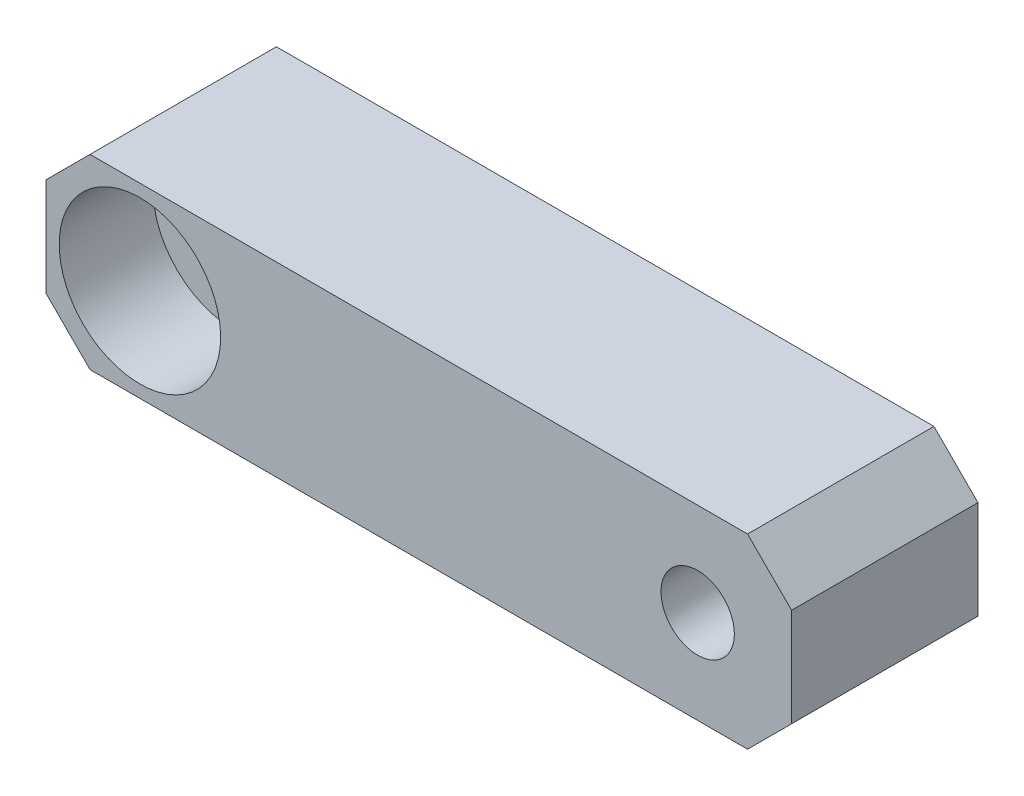
ISO-10303-21;
HEADER;
FILE_DESCRIPTION(('STEP AP214'),'2;1');
FILE_NAME('part.step','',(''),(''),'','','');
FILE_SCHEMA(('AUTOMOTIVE_DESIGN { 1 0 10303 214 1 1 1 1 }'));
ENDSEC;
DATA;
#1=APPLICATION_CONTEXT('core data for automotive mechanical design processes');
#2=APPLICATION_PROTOCOL_DEFINITION('international standard','automotive_design',2000,#1);
#3=PRODUCT_CONTEXT('',#1,'mechanical');
#4=PRODUCT('Part','Part','',(#3));
#5=PRODUCT_RELATED_PRODUCT_CATEGORY('part','',(#4));
#6=PRODUCT_DEFINITION_FORMATION('','',#4);
#7=PRODUCT_DEFINITION_CONTEXT('part definition',#1,'design');
#8=PRODUCT_DEFINITION('design','',#6,#7);
#9=PRODUCT_DEFINITION_SHAPE('','',#8);
#10=(LENGTH_UNIT() NAMED_UNIT(*) SI_UNIT(.MILLI.,.METRE.));
#11=(NAMED_UNIT(*) PLANE_ANGLE_UNIT() SI_UNIT($,.RADIAN.));
#12=(NAMED_UNIT(*) SI_UNIT($,.STERADIAN.) SOLID_ANGLE_UNIT());
#13=UNCERTAINTY_MEASURE_WITH_UNIT(LENGTH_MEASURE(1.E-05),#10,'distance_accuracy_value','');
#14=(GEOMETRIC_REPRESENTATION_CONTEXT(3) GLOBAL_UNCERTAINTY_ASSIGNED_CONTEXT((#13)) GLOBAL_UNIT_ASSIGNED_CONTEXT((#10,
#11,#12)) REPRESENTATION_CONTEXT('',''));
#15=CARTESIAN_POINT('',(0.,0.,0.));
#16=DIRECTION('',(0.,0.,1.));
#17=DIRECTION('',(1.,0.,0.));
#18=AXIS2_PLACEMENT_3D('',#15,#16,#17);
#19=CARTESIAN_POINT('',(22.4,6.35,6.35));
#20=DIRECTION('',(0.,-1.,0.));
#21=DIRECTION('',(0.,0.,-1.));
#22=AXIS2_PLACEMENT_3D('',#19,#20,#21);
#23=PLANE('',#22);
#24=DIRECTION('',(-1.,0.,0.));
#25=VECTOR('',#24,1.);
#26=CARTESIAN_POINT('',(22.4,6.35,-6.35));
#27=LINE('',#26,#25);
#28=CARTESIAN_POINT('',(22.4,6.35,-6.35));
#29=VERTEX_POINT('',#28);
#30=CARTESIAN_POINT('',(-22.4,6.35,-6.35));
#31=VERTEX_POINT('',#30);
#32=EDGE_CURVE('E131',#29,#31,#27,.T.);
#33=ORIENTED_EDGE('',*,*,#32,.T.);
#34=DIRECTION('',(0.,0.,-1.));
#35=VECTOR('',#34,1.);
#36=CARTESIAN_POINT('',(-22.4,6.35,6.35));
#37=LINE('',#36,#35);
#38=CARTESIAN_POINT('',(-22.4,6.35,6.35));
#39=VERTEX_POINT('',#38);
#40=EDGE_CURVE('E11',#39,#31,#37,.T.);
#41=ORIENTED_EDGE('',*,*,#40,.F.);
#42=DIRECTION('',(-1.,0.,0.));
#43=VECTOR('',#42,1.);
#44=CARTESIAN_POINT('',(22.4,6.35,6.35));
#45=LINE('',#44,#43);
#46=CARTESIAN_POINT('',(22.4,6.35,6.35));
#47=VERTEX_POINT('',#46);
#48=EDGE_CURVE('E146',#47,#39,#45,.T.);
#49=ORIENTED_EDGE('',*,*,#48,.F.);
#50=DIRECTION('',(0.,0.,-1.));
#51=VECTOR('',#50,1.);
#52=CARTESIAN_POINT('',(22.4,6.35,6.35));
#53=LINE('',#52,#51);
#54=EDGE_CURVE('E127',#47,#29,#53,.T.);
#55=ORIENTED_EDGE('',*,*,#54,.T.);
#56=EDGE_LOOP('',(#33,#41,#49,#55));
#57=FACE_BOUND('',#56,.T.);
#58=ADVANCED_FACE('F35',(#57),#23,.F.);
#59=CARTESIAN_POINT('',(-22.4,6.35,6.35));
#60=DIRECTION('',(0.707106781186548,-0.707106781186547,0.));
#61=DIRECTION('',(0.707106781186547,0.707106781186548,0.));
#62=AXIS2_PLACEMENT_3D('',#59,#60,#61);
#63=PLANE('',#62);
#64=DIRECTION('',(-0.707106781186547,-0.707106781186548,0.));
#65=VECTOR('',#64,1.);
#66=CARTESIAN_POINT('',(-22.4,6.35,-6.35));
#67=LINE('',#66,#65);
#68=CARTESIAN_POINT('',(-25.4,3.35,-6.35));
#69=VERTEX_POINT('',#68);
#70=EDGE_CURVE('E134',#31,#69,#67,.T.);
#71=ORIENTED_EDGE('',*,*,#70,.T.);
#72=DIRECTION('',(0.,0.,-1.));
#73=VECTOR('',#72,1.);
#74=CARTESIAN_POINT('',(-25.4,3.35,6.35));
#75=LINE('',#74,#73);
#76=CARTESIAN_POINT('',(-25.4,3.35,6.35));
#77=VERTEX_POINT('',#76);
#78=EDGE_CURVE('E43',#77,#69,#75,.T.);
#79=ORIENTED_EDGE('',*,*,#78,.F.);
#80=DIRECTION('',(-0.707106781186547,-0.707106781186548,0.));
#81=VECTOR('',#80,1.);
#82=CARTESIAN_POINT('',(-22.4,6.35,6.35));
#83=LINE('',#82,#81);
#84=EDGE_CURVE('E94',#39,#77,#83,.T.);
#85=ORIENTED_EDGE('',*,*,#84,.F.);
#86=ORIENTED_EDGE('',*,*,#40,.T.);
#87=EDGE_LOOP('',(#71,#79,#85,#86));
#88=FACE_BOUND('',#87,.T.);
#89=ADVANCED_FACE('F221',(#88),#63,.F.);
#90=CARTESIAN_POINT('',(-25.4,3.35,6.35));
#91=DIRECTION('',(1.,0.,0.));
#92=DIRECTION('',(0.,0.,-1.));
#93=AXIS2_PLACEMENT_3D('',#90,#91,#92);
#94=PLANE('',#93);
#95=DIRECTION('',(0.,-1.,0.));
#96=VECTOR('',#95,1.);
#97=CARTESIAN_POINT('',(-25.4,3.35,-6.35));
#98=LINE('',#97,#96);
#99=CARTESIAN_POINT('',(-25.4,-3.35,-6.35));
#100=VERTEX_POINT('',#99);
#101=EDGE_CURVE('E137',#69,#100,#98,.T.);
#102=ORIENTED_EDGE('',*,*,#101,.T.);
#103=DIRECTION('',(0.,0.,-1.));
#104=VECTOR('',#103,1.);
#105=CARTESIAN_POINT('',(-25.4,-3.35,6.35));
#106=LINE('',#105,#104);
#107=CARTESIAN_POINT('',(-25.4,-3.35,6.35));
#108=VERTEX_POINT('',#107);
#109=EDGE_CURVE('E153',#108,#100,#106,.T.);
#110=ORIENTED_EDGE('',*,*,#109,.F.);
#111=DIRECTION('',(0.,-1.,0.));
#112=VECTOR('',#111,1.);
#113=CARTESIAN_POINT('',(-25.4,3.35,6.35));
#114=LINE('',#113,#112);
#115=EDGE_CURVE('E161',#77,#108,#114,.T.);
#116=ORIENTED_EDGE('',*,*,#115,.F.);
#117=ORIENTED_EDGE('',*,*,#78,.T.);
#118=EDGE_LOOP('',(#102,#110,#116,#117));
#119=FACE_BOUND('',#118,.T.);
#120=ADVANCED_FACE('F159',(#119),#94,.F.);
#121=CARTESIAN_POINT('',(-22.4,-6.35,6.35));
#122=DIRECTION('',(0.707106781186548,0.707106781186547,0.));
#123=DIRECTION('',(-0.707106781186547,0.707106781186548,0.));
#124=AXIS2_PLACEMENT_3D('',#121,#122,#123);
#125=PLANE('',#124);
#126=DIRECTION('',(0.707106781186547,-0.707106781186548,0.));
#127=VECTOR('',#126,1.);
#128=CARTESIAN_POINT('',(-22.4,-6.35,-6.35));
#129=LINE('',#128,#127);
#130=CARTESIAN_POINT('',(-22.4,-6.35,-6.35));
#131=VERTEX_POINT('',#130);
#132=EDGE_CURVE('E139',#100,#131,#129,.T.);
#133=ORIENTED_EDGE('',*,*,#132,.T.);
#134=DIRECTION('',(0.,0.,-1.));
#135=VECTOR('',#134,1.);
#136=CARTESIAN_POINT('',(-22.4,-6.35,6.35));
#137=LINE('',#136,#135);
#138=CARTESIAN_POINT('',(-22.4,-6.35,6.35));
#139=VERTEX_POINT('',#138);
#140=EDGE_CURVE('E150',#139,#131,#137,.T.);
#141=ORIENTED_EDGE('',*,*,#140,.F.);
#142=DIRECTION('',(0.707106781186547,-0.707106781186548,0.));
#143=VECTOR('',#142,1.);
#144=CARTESIAN_POINT('',(-22.4,-6.35,6.35));
#145=LINE('',#144,#143);
#146=EDGE_CURVE('E173',#108,#139,#145,.T.);
#147=ORIENTED_EDGE('',*,*,#146,.F.);
#148=ORIENTED_EDGE('',*,*,#109,.T.);
#149=EDGE_LOOP('',(#133,#141,#147,#148));
#150=FACE_BOUND('',#149,.T.);
#151=ADVANCED_FACE('F169',(#150),#125,.F.);
#152=CARTESIAN_POINT('',(22.4,-6.35,6.35));
#153=DIRECTION('',(0.,1.,0.));
#154=DIRECTION('',(0.,0.,1.));
#155=AXIS2_PLACEMENT_3D('',#152,#153,#154);
#156=PLANE('',#155);
#157=DIRECTION('',(1.,0.,0.));
#158=VECTOR('',#157,1.);
#159=CARTESIAN_POINT('',(22.4,-6.35,-6.35));
#160=LINE('',#159,#158);
#161=CARTESIAN_POINT('',(22.4,-6.35,-6.35));
#162=VERTEX_POINT('',#161);
#163=EDGE_CURVE('E141',#131,#162,#160,.T.);
#164=ORIENTED_EDGE('',*,*,#163,.T.);
#165=DIRECTION('',(0.,0.,-1.));
#166=VECTOR('',#165,1.);
#167=CARTESIAN_POINT('',(22.4,-6.35,6.35));
#168=LINE('',#167,#166);
#169=CARTESIAN_POINT('',(22.4,-6.35,6.35));
#170=VERTEX_POINT('',#169);
#171=EDGE_CURVE('E122',#170,#162,#168,.T.);
#172=ORIENTED_EDGE('',*,*,#171,.F.);
#173=DIRECTION('',(1.,0.,0.));
#174=VECTOR('',#173,1.);
#175=CARTESIAN_POINT('',(22.4,-6.35,6.35));
#176=LINE('',#175,#174);
#177=EDGE_CURVE('E113',#139,#170,#176,.T.);
#178=ORIENTED_EDGE('',*,*,#177,.F.);
#179=ORIENTED_EDGE('',*,*,#140,.T.);
#180=EDGE_LOOP('',(#164,#172,#178,#179));
#181=FACE_BOUND('',#180,.T.);
#182=ADVANCED_FACE('F172',(#181),#156,.F.);
#183=CARTESIAN_POINT('',(25.4,-3.35,6.35));
#184=DIRECTION('',(-0.707106781186548,0.707106781186547,0.));
#185=DIRECTION('',(-0.707106781186547,-0.707106781186548,0.));
#186=AXIS2_PLACEMENT_3D('',#183,#184,#185);
#187=PLANE('',#186);
#188=DIRECTION('',(0.707106781186547,0.707106781186548,0.));
#189=VECTOR('',#188,1.);
#190=CARTESIAN_POINT('',(25.4,-3.35,-6.35));
#191=LINE('',#190,#189);
#192=CARTESIAN_POINT('',(25.4,-3.35,-6.35));
#193=VERTEX_POINT('',#192);
#194=EDGE_CURVE('E121',#162,#193,#191,.T.);
#195=ORIENTED_EDGE('',*,*,#194,.T.);
#196=DIRECTION('',(0.,0.,-1.));
#197=VECTOR('',#196,1.);
#198=CARTESIAN_POINT('',(25.4,-3.35,6.35));
#199=LINE('',#198,#197);
#200=CARTESIAN_POINT('',(25.4,-3.35,6.35));
#201=VERTEX_POINT('',#200);
#202=EDGE_CURVE('E118',#201,#193,#199,.T.);
#203=ORIENTED_EDGE('',*,*,#202,.F.);
#204=DIRECTION('',(0.707106781186547,0.707106781186548,0.));
#205=VECTOR('',#204,1.);
#206=CARTESIAN_POINT('',(25.4,-3.35,6.35));
#207=LINE('',#206,#205);
#208=EDGE_CURVE('E107',#170,#201,#207,.T.);
#209=ORIENTED_EDGE('',*,*,#208,.F.);
#210=ORIENTED_EDGE('',*,*,#171,.T.);
#211=EDGE_LOOP('',(#195,#203,#209,#210));
#212=FACE_BOUND('',#211,.T.);
#213=ADVANCED_FACE('F119',(#212),#187,.F.);
#214=CARTESIAN_POINT('',(25.4,3.35,6.35));
#215=DIRECTION('',(-1.,0.,0.));
#216=DIRECTION('',(0.,0.,1.));
#217=AXIS2_PLACEMENT_3D('',#214,#215,#216);
#218=PLANE('',#217);
#219=DIRECTION('',(0.,1.,0.));
#220=VECTOR('',#219,1.);
#221=CARTESIAN_POINT('',(25.4,3.35,-6.35));
#222=LINE('',#221,#220);
#223=CARTESIAN_POINT('',(25.4,3.35,-6.35));
#224=VERTEX_POINT('',#223);
#225=EDGE_CURVE('E80',#193,#224,#222,.T.);
#226=ORIENTED_EDGE('',*,*,#225,.T.);
#227=DIRECTION('',(0.,0.,-1.));
#228=VECTOR('',#227,1.);
#229=CARTESIAN_POINT('',(25.4,3.35,6.35));
#230=LINE('',#229,#228);
#231=CARTESIAN_POINT('',(25.4,3.35,6.35));
#232=VERTEX_POINT('',#231);
#233=EDGE_CURVE('E123',#232,#224,#230,.T.);
#234=ORIENTED_EDGE('',*,*,#233,.F.);
#235=DIRECTION('',(0.,1.,0.));
#236=VECTOR('',#235,1.);
#237=CARTESIAN_POINT('',(25.4,3.35,6.35));
#238=LINE('',#237,#236);
#239=EDGE_CURVE('E111',#201,#232,#238,.T.);
#240=ORIENTED_EDGE('',*,*,#239,.F.);
#241=ORIENTED_EDGE('',*,*,#202,.T.);
#242=EDGE_LOOP('',(#226,#234,#240,#241));
#243=FACE_BOUND('',#242,.T.);
#244=ADVANCED_FACE('F125',(#243),#218,.F.);
#245=CARTESIAN_POINT('',(25.4,3.35,6.35));
#246=DIRECTION('',(-0.707106781186548,-0.707106781186547,0.));
#247=DIRECTION('',(0.707106781186547,-0.707106781186548,0.));
#248=AXIS2_PLACEMENT_3D('',#245,#246,#247);
#249=PLANE('',#248);
#250=DIRECTION('',(-0.707106781186547,0.707106781186548,0.));
#251=VECTOR('',#250,1.);
#252=CARTESIAN_POINT('',(25.4,3.35,-6.35));
#253=LINE('',#252,#251);
#254=EDGE_CURVE('E86',#224,#29,#253,.T.);
#255=ORIENTED_EDGE('',*,*,#254,.T.);
#256=ORIENTED_EDGE('',*,*,#54,.F.);
#257=DIRECTION('',(-0.707106781186547,0.707106781186548,0.));
#258=VECTOR('',#257,1.);
#259=CARTESIAN_POINT('',(25.4,3.35,6.35));
#260=LINE('',#259,#258);
#261=EDGE_CURVE('E51',#232,#47,#260,.T.);
#262=ORIENTED_EDGE('',*,*,#261,.F.);
#263=ORIENTED_EDGE('',*,*,#233,.T.);
#264=EDGE_LOOP('',(#255,#256,#262,#263));
#265=FACE_BOUND('',#264,.T.);
#266=ADVANCED_FACE('F201',(#265),#249,.F.);
#267=CARTESIAN_POINT('',(0.,0.,6.35));
#268=DIRECTION('',(0.,0.,1.));
#269=DIRECTION('',(1.,0.,0.));
#270=AXIS2_PLACEMENT_3D('',#267,#268,#269);
#271=PLANE('',#270);
#272=CARTESIAN_POINT('',(-19.,0.,6.35));
#273=DIRECTION('',(0.,0.,1.));
#274=DIRECTION('',(1.,0.,0.));
#275=AXIS2_PLACEMENT_3D('',#272,#273,#274);
#276=CIRCLE('',#275,5.49999999999999);
#277=CARTESIAN_POINT('',(-13.5,0.,6.35));
#278=VERTEX_POINT('',#277);
#279=EDGE_CURVE('E193',#278,#278,#276,.T.);
#280=ORIENTED_EDGE('',*,*,#279,.F.);
#281=EDGE_LOOP('',(#280));
#282=FACE_BOUND('',#281,.T.);
#283=CARTESIAN_POINT('',(19.,0.,6.35));
#284=DIRECTION('',(0.,0.,1.));
#285=DIRECTION('',(1.,0.,0.));
#286=AXIS2_PLACEMENT_3D('',#283,#284,#285);
#287=CIRCLE('',#286,2.49999999999999);
#288=CARTESIAN_POINT('',(21.5,0.,6.35));
#289=VERTEX_POINT('',#288);
#290=EDGE_CURVE('E181',#289,#289,#287,.T.);
#291=ORIENTED_EDGE('',*,*,#290,.F.);
#292=EDGE_LOOP('',(#291));
#293=FACE_BOUND('',#292,.T.);
#294=ORIENTED_EDGE('',*,*,#48,.T.);
#295=ORIENTED_EDGE('',*,*,#84,.T.);
#296=ORIENTED_EDGE('',*,*,#115,.T.);
#297=ORIENTED_EDGE('',*,*,#146,.T.);
#298=ORIENTED_EDGE('',*,*,#177,.T.);
#299=ORIENTED_EDGE('',*,*,#208,.T.);
#300=ORIENTED_EDGE('',*,*,#239,.T.);
#301=ORIENTED_EDGE('',*,*,#261,.T.);
#302=EDGE_LOOP('',(#294,#295,#296,#297,#298,#299,#300,#301));
#303=FACE_BOUND('',#302,.T.);
#304=ADVANCED_FACE('F109',(#282,#293,#303),#271,.T.);
#305=CARTESIAN_POINT('',(0.,0.,-6.35));
#306=DIRECTION('',(0.,0.,1.));
#307=DIRECTION('',(1.,0.,0.));
#308=AXIS2_PLACEMENT_3D('',#305,#306,#307);
#309=PLANE('',#308);
#310=CARTESIAN_POINT('',(-19.,0.,-6.35));
#311=DIRECTION('',(0.,0.,1.));
#312=DIRECTION('',(1.,0.,0.));
#313=AXIS2_PLACEMENT_3D('',#310,#311,#312);
#314=CIRCLE('',#313,3.3);
#315=CARTESIAN_POINT('',(-15.7,0.,-6.35));
#316=VERTEX_POINT('',#315);
#317=EDGE_CURVE('E184',#316,#316,#314,.T.);
#318=ORIENTED_EDGE('',*,*,#317,.T.);
#319=EDGE_LOOP('',(#318));
#320=FACE_BOUND('',#319,.T.);
#321=CARTESIAN_POINT('',(19.,0.,-6.35));
#322=DIRECTION('',(0.,0.,1.));
#323=DIRECTION('',(1.,0.,0.));
#324=AXIS2_PLACEMENT_3D('',#321,#322,#323);
#325=CIRCLE('',#324,2.5);
#326=CARTESIAN_POINT('',(21.5,0.,-6.35));
#327=VERTEX_POINT('',#326);
#328=EDGE_CURVE('E135',#327,#327,#325,.T.);
#329=ORIENTED_EDGE('',*,*,#328,.T.);
#330=EDGE_LOOP('',(#329));
#331=FACE_BOUND('',#330,.T.);
#332=ORIENTED_EDGE('',*,*,#32,.F.);
#333=ORIENTED_EDGE('',*,*,#254,.F.);
#334=ORIENTED_EDGE('',*,*,#225,.F.);
#335=ORIENTED_EDGE('',*,*,#194,.F.);
#336=ORIENTED_EDGE('',*,*,#163,.F.);
#337=ORIENTED_EDGE('',*,*,#132,.F.);
#338=ORIENTED_EDGE('',*,*,#101,.F.);
#339=ORIENTED_EDGE('',*,*,#70,.F.);
#340=EDGE_LOOP('',(#332,#333,#334,#335,#336,#337,#338,#339));
#341=FACE_BOUND('',#340,.T.);
#342=ADVANCED_FACE('F165',(#320,#331,#341),#309,.F.);
#343=CARTESIAN_POINT('',(19.,0.,6.35));
#344=DIRECTION('',(0.,0.,1.));
#345=DIRECTION('',(1.,0.,0.));
#346=AXIS2_PLACEMENT_3D('',#343,#344,#345);
#347=CYLINDRICAL_SURFACE('',#346,2.49999999999999);
#348=ORIENTED_EDGE('',*,*,#328,.F.);
#349=EDGE_LOOP('',(#348));
#350=FACE_BOUND('',#349,.T.);
#351=ORIENTED_EDGE('',*,*,#290,.T.);
#352=EDGE_LOOP('',(#351));
#353=FACE_BOUND('',#352,.T.);
#354=ADVANCED_FACE('F205',(#350,#353),#347,.F.);
#355=CARTESIAN_POINT('',(-19.,0.,6.35));
#356=DIRECTION('',(0.,0.,1.));
#357=DIRECTION('',(1.,0.,0.));
#358=AXIS2_PLACEMENT_3D('',#355,#356,#357);
#359=CYLINDRICAL_SURFACE('',#358,3.3);
#360=ORIENTED_EDGE('',*,*,#317,.F.);
#361=EDGE_LOOP('',(#360));
#362=FACE_BOUND('',#361,.T.);
#363=CARTESIAN_POINT('',(-19.,0.,-0.0499999999999997));
#364=DIRECTION('',(0.,0.,1.));
#365=DIRECTION('',(1.,0.,0.));
#366=AXIS2_PLACEMENT_3D('',#363,#364,#365);
#367=CIRCLE('',#366,3.3);
#368=CARTESIAN_POINT('',(-15.7,0.,-0.0499999999999997));
#369=VERTEX_POINT('',#368);
#370=EDGE_CURVE('E187',#369,#369,#367,.T.);
#371=ORIENTED_EDGE('',*,*,#370,.T.);
#372=EDGE_LOOP('',(#371));
#373=FACE_BOUND('',#372,.T.);
#374=ADVANCED_FACE('F207',(#362,#373),#359,.F.);
#375=CARTESIAN_POINT('',(-15.7,0.,-0.0499999999999997));
#376=DIRECTION('',(0.,0.,-1.));
#377=DIRECTION('',(-1.,0.,0.));
#378=AXIS2_PLACEMENT_3D('',#375,#376,#377);
#379=PLANE('',#378);
#380=ORIENTED_EDGE('',*,*,#370,.F.);
#381=EDGE_LOOP('',(#380));
#382=FACE_BOUND('',#381,.T.);
#383=CARTESIAN_POINT('',(-19.,0.,-0.0499999999999997));
#384=DIRECTION('',(0.,0.,1.));
#385=DIRECTION('',(1.,0.,0.));
#386=AXIS2_PLACEMENT_3D('',#383,#384,#385);
#387=CIRCLE('',#386,5.5);
#388=CARTESIAN_POINT('',(-13.5,0.,-0.0499999999999997));
#389=VERTEX_POINT('',#388);
#390=EDGE_CURVE('E190',#389,#389,#387,.T.);
#391=ORIENTED_EDGE('',*,*,#390,.T.);
#392=EDGE_LOOP('',(#391));
#393=FACE_BOUND('',#392,.T.);
#394=ADVANCED_FACE('F214',(#382,#393),#379,.F.);
#395=CARTESIAN_POINT('',(-19.,0.,6.35));
#396=DIRECTION('',(0.,0.,1.));
#397=DIRECTION('',(1.,0.,0.));
#398=AXIS2_PLACEMENT_3D('',#395,#396,#397);
#399=CYLINDRICAL_SURFACE('',#398,5.5);
#400=ORIENTED_EDGE('',*,*,#390,.F.);
#401=EDGE_LOOP('',(#400));
#402=FACE_BOUND('',#401,.T.);
#403=ORIENTED_EDGE('',*,*,#279,.T.);
#404=EDGE_LOOP('',(#403));
#405=FACE_BOUND('',#404,.T.);
#406=ADVANCED_FACE('F197',(#402,#405),#399,.F.);
#407=CLOSED_SHELL('',(#58,#89,#120,#151,#182,#213,#244,#266,#304,#342,#354,#374,#394,#406));
#408=MANIFOLD_SOLID_BREP('B2',#407);
#409=ADVANCED_BREP_SHAPE_REPRESENTATION('',(#18,#408),#14);
#410=SHAPE_DEFINITION_REPRESENTATION(#9,#409);
ENDSEC;
END-ISO-10303-21;
